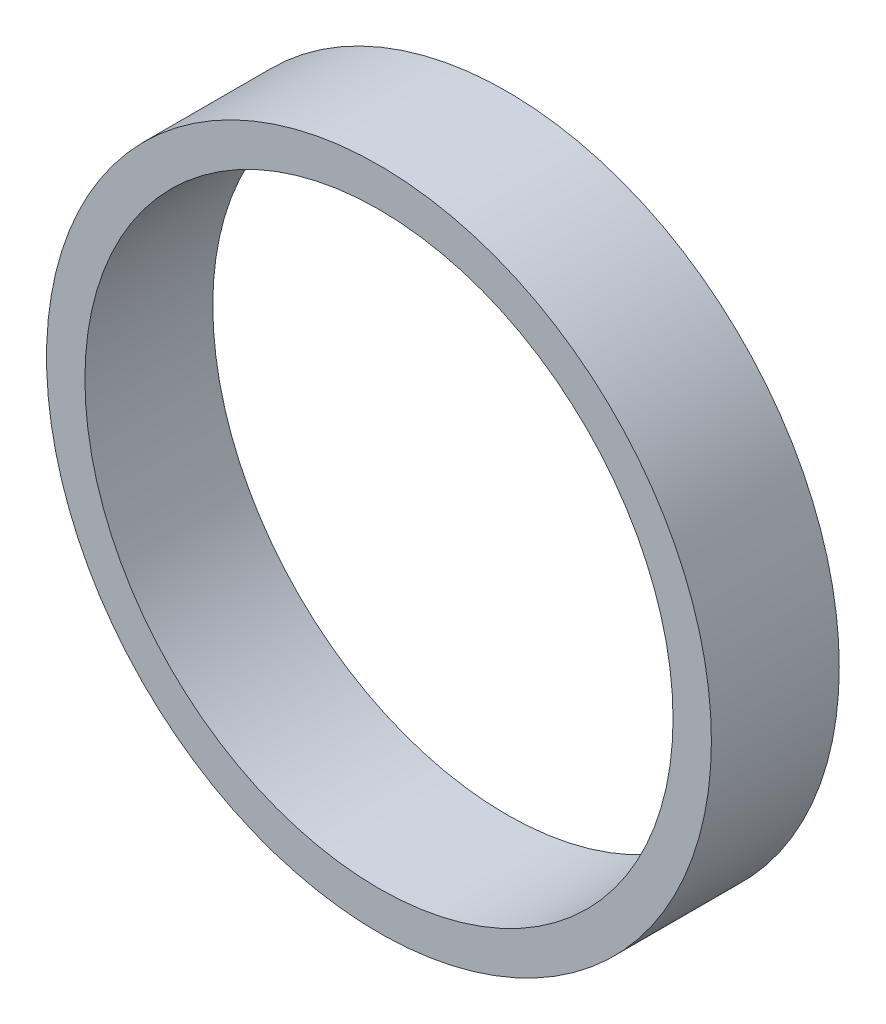
ISO-10303-21;
HEADER;
FILE_DESCRIPTION(('STEP AP214'),'2;1');
FILE_NAME('part.step','',(''),(''),'','','');
FILE_SCHEMA(('AUTOMOTIVE_DESIGN { 1 0 10303 214 1 1 1 1 }'));
ENDSEC;
DATA;
#1=APPLICATION_CONTEXT('core data for automotive mechanical design processes');
#2=APPLICATION_PROTOCOL_DEFINITION('international standard','automotive_design',2000,#1);
#3=PRODUCT_CONTEXT('',#1,'mechanical');
#4=PRODUCT('Part','Part','',(#3));
#5=PRODUCT_RELATED_PRODUCT_CATEGORY('part','',(#4));
#6=PRODUCT_DEFINITION_FORMATION('','',#4);
#7=PRODUCT_DEFINITION_CONTEXT('part definition',#1,'design');
#8=PRODUCT_DEFINITION('design','',#6,#7);
#9=PRODUCT_DEFINITION_SHAPE('','',#8);
#10=(LENGTH_UNIT() NAMED_UNIT(*) SI_UNIT(.MILLI.,.METRE.));
#11=(NAMED_UNIT(*) PLANE_ANGLE_UNIT() SI_UNIT($,.RADIAN.));
#12=(NAMED_UNIT(*) SI_UNIT($,.STERADIAN.) SOLID_ANGLE_UNIT());
#13=UNCERTAINTY_MEASURE_WITH_UNIT(LENGTH_MEASURE(1.E-05),#10,'distance_accuracy_value','');
#14=(GEOMETRIC_REPRESENTATION_CONTEXT(3) GLOBAL_UNCERTAINTY_ASSIGNED_CONTEXT((#13)) GLOBAL_UNIT_ASSIGNED_CONTEXT((#10,
#11,#12)) REPRESENTATION_CONTEXT('',''));
#15=CARTESIAN_POINT('',(0.,0.,0.));
#16=DIRECTION('',(0.,0.,1.));
#17=DIRECTION('',(1.,0.,0.));
#18=AXIS2_PLACEMENT_3D('',#15,#16,#17);
#19=CARTESIAN_POINT('',(0.,0.,10.));
#20=DIRECTION('',(0.,0.,1.));
#21=DIRECTION('',(1.,0.,0.));
#22=AXIS2_PLACEMENT_3D('',#19,#20,#21);
#23=PLANE('',#22);
#24=CARTESIAN_POINT('',(0.,0.,10.));
#25=DIRECTION('',(0.,0.,1.));
#26=DIRECTION('',(1.,0.,0.));
#27=AXIS2_PLACEMENT_3D('',#24,#25,#26);
#28=CIRCLE('',#27,26.);
#29=CARTESIAN_POINT('',(26.,0.,10.));
#30=VERTEX_POINT('',#29);
#31=EDGE_CURVE('E10',#30,#30,#28,.T.);
#32=ORIENTED_EDGE('',*,*,#31,.T.);
#33=EDGE_LOOP('',(#32));
#34=FACE_BOUND('',#33,.T.);
#35=CARTESIAN_POINT('',(0.,0.,10.));
#36=DIRECTION('',(0.,0.,1.));
#37=DIRECTION('',(1.,0.,0.));
#38=AXIS2_PLACEMENT_3D('',#35,#36,#37);
#39=CIRCLE('',#38,23.);
#40=CARTESIAN_POINT('',(23.,0.,10.));
#41=VERTEX_POINT('',#40);
#42=EDGE_CURVE('E43',#41,#41,#39,.T.);
#43=ORIENTED_EDGE('',*,*,#42,.F.);
#44=EDGE_LOOP('',(#43));
#45=FACE_BOUND('',#44,.T.);
#46=ADVANCED_FACE('F32',(#34,#45),#23,.T.);
#47=CARTESIAN_POINT('',(0.,0.,0.));
#48=DIRECTION('',(0.,0.,1.));
#49=DIRECTION('',(1.,0.,0.));
#50=AXIS2_PLACEMENT_3D('',#47,#48,#49);
#51=PLANE('',#50);
#52=CARTESIAN_POINT('',(0.,0.,0.));
#53=DIRECTION('',(0.,0.,1.));
#54=DIRECTION('',(1.,0.,0.));
#55=AXIS2_PLACEMENT_3D('',#52,#53,#54);
#56=CIRCLE('',#55,26.);
#57=CARTESIAN_POINT('',(26.,0.,0.));
#58=VERTEX_POINT('',#57);
#59=EDGE_CURVE('E36',#58,#58,#56,.T.);
#60=ORIENTED_EDGE('',*,*,#59,.F.);
#61=EDGE_LOOP('',(#60));
#62=FACE_BOUND('',#61,.T.);
#63=CARTESIAN_POINT('',(0.,0.,0.));
#64=DIRECTION('',(0.,0.,1.));
#65=DIRECTION('',(1.,0.,0.));
#66=AXIS2_PLACEMENT_3D('',#63,#64,#65);
#67=CIRCLE('',#66,23.);
#68=CARTESIAN_POINT('',(23.,0.,0.));
#69=VERTEX_POINT('',#68);
#70=EDGE_CURVE('E45',#69,#69,#67,.T.);
#71=ORIENTED_EDGE('',*,*,#70,.T.);
#72=EDGE_LOOP('',(#71));
#73=FACE_BOUND('',#72,.T.);
#74=ADVANCED_FACE('F55',(#62,#73),#51,.F.);
#75=CARTESIAN_POINT('',(0.,0.,10.));
#76=DIRECTION('',(0.,0.,-1.));
#77=DIRECTION('',(-1.,0.,0.));
#78=AXIS2_PLACEMENT_3D('',#75,#76,#77);
#79=CYLINDRICAL_SURFACE('',#78,26.);
#80=ORIENTED_EDGE('',*,*,#31,.F.);
#81=EDGE_LOOP('',(#80));
#82=FACE_BOUND('',#81,.T.);
#83=ORIENTED_EDGE('',*,*,#59,.T.);
#84=EDGE_LOOP('',(#83));
#85=FACE_BOUND('',#84,.T.);
#86=ADVANCED_FACE('F34',(#82,#85),#79,.T.);
#87=CARTESIAN_POINT('',(0.,0.,10.));
#88=DIRECTION('',(0.,0.,-1.));
#89=DIRECTION('',(-1.,0.,0.));
#90=AXIS2_PLACEMENT_3D('',#87,#88,#89);
#91=CYLINDRICAL_SURFACE('',#90,23.);
#92=ORIENTED_EDGE('',*,*,#42,.T.);
#93=EDGE_LOOP('',(#92));
#94=FACE_BOUND('',#93,.T.);
#95=ORIENTED_EDGE('',*,*,#70,.F.);
#96=EDGE_LOOP('',(#95));
#97=FACE_BOUND('',#96,.T.);
#98=ADVANCED_FACE('F51',(#94,#97),#91,.F.);
#99=CLOSED_SHELL('',(#46,#74,#86,#98));
#100=MANIFOLD_SOLID_BREP('B2',#99);
#101=ADVANCED_BREP_SHAPE_REPRESENTATION('',(#18,#100),#14);
#102=SHAPE_DEFINITION_REPRESENTATION(#9,#101);
ENDSEC;
END-ISO-10303-21;
